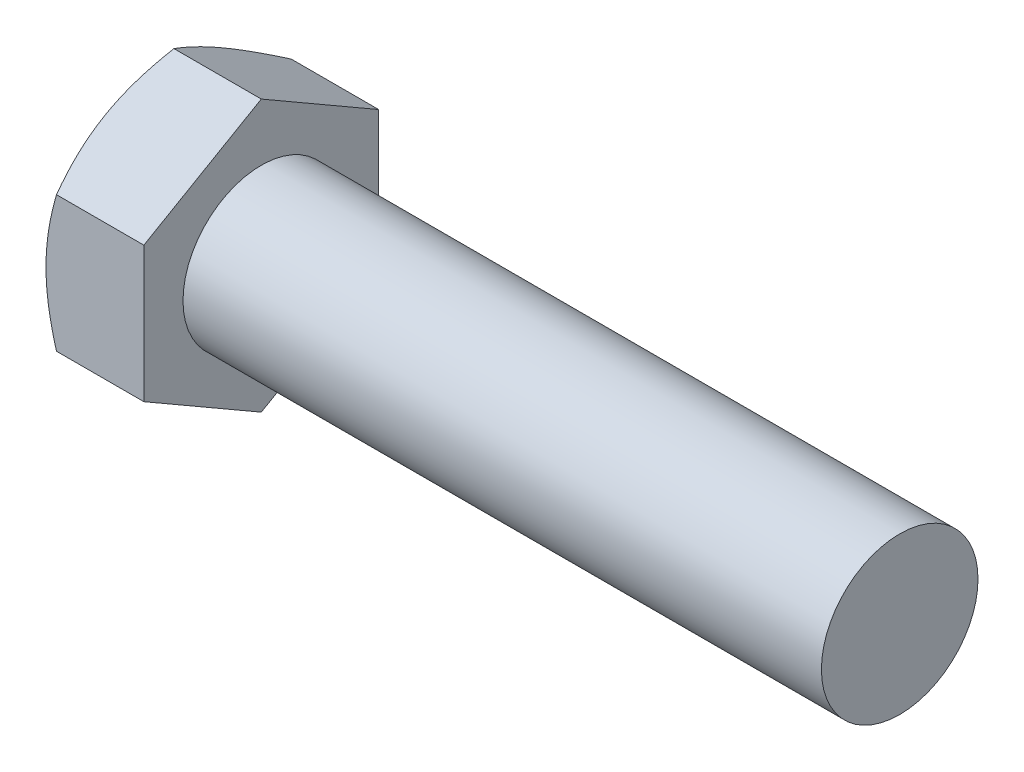
ISO-10303-21;
HEADER;
FILE_DESCRIPTION(('STEP AP214'),'2;1');
FILE_NAME('part.step','',(''),(''),'','','');
FILE_SCHEMA(('AUTOMOTIVE_DESIGN { 1 0 10303 214 1 1 1 1 }'));
ENDSEC;
DATA;
#1=APPLICATION_CONTEXT('core data for automotive mechanical design processes');
#2=APPLICATION_PROTOCOL_DEFINITION('international standard','automotive_design',2000,#1);
#3=PRODUCT_CONTEXT('',#1,'mechanical');
#4=PRODUCT('Part','Part','',(#3));
#5=PRODUCT_RELATED_PRODUCT_CATEGORY('part','',(#4));
#6=PRODUCT_DEFINITION_FORMATION('','',#4);
#7=PRODUCT_DEFINITION_CONTEXT('part definition',#1,'design');
#8=PRODUCT_DEFINITION('design','',#6,#7);
#9=PRODUCT_DEFINITION_SHAPE('','',#8);
#10=(LENGTH_UNIT() NAMED_UNIT(*) SI_UNIT(.MILLI.,.METRE.));
#11=(NAMED_UNIT(*) PLANE_ANGLE_UNIT() SI_UNIT($,.RADIAN.));
#12=(NAMED_UNIT(*) SI_UNIT($,.STERADIAN.) SOLID_ANGLE_UNIT());
#13=UNCERTAINTY_MEASURE_WITH_UNIT(LENGTH_MEASURE(1.E-05),#10,'distance_accuracy_value','');
#14=(GEOMETRIC_REPRESENTATION_CONTEXT(3) GLOBAL_UNCERTAINTY_ASSIGNED_CONTEXT((#13)) GLOBAL_UNIT_ASSIGNED_CONTEXT((#10,
#11,#12)) REPRESENTATION_CONTEXT('',''));
#15=CARTESIAN_POINT('',(0.,0.,0.));
#16=DIRECTION('',(0.,0.,1.));
#17=DIRECTION('',(1.,0.,0.));
#18=AXIS2_PLACEMENT_3D('',#15,#16,#17);
#19=CARTESIAN_POINT('',(61.,0.,0.));
#20=DIRECTION('',(-1.,0.,0.));
#21=DIRECTION('',(0.,0.,1.));
#22=AXIS2_PLACEMENT_3D('',#19,#20,#21);
#23=CYLINDRICAL_SURFACE('',#22,6.);
#24=CARTESIAN_POINT('',(0.,0.,0.));
#25=DIRECTION('',(-1.,0.,0.));
#26=DIRECTION('',(0.,0.,1.));
#27=AXIS2_PLACEMENT_3D('',#24,#25,#26);
#28=CIRCLE('',#27,6.);
#29=CARTESIAN_POINT('',(0.,0.,6.));
#30=VERTEX_POINT('',#29);
#31=EDGE_CURVE('E43',#30,#30,#28,.F.);
#32=ORIENTED_EDGE('',*,*,#31,.T.);
#33=EDGE_LOOP('',(#32));
#34=FACE_BOUND('',#33,.T.);
#35=CARTESIAN_POINT('',(48.9325515217763,0.,0.));
#36=DIRECTION('',(1.,0.,0.));
#37=DIRECTION('',(0.,0.,-1.));
#38=AXIS2_PLACEMENT_3D('',#35,#36,#37);
#39=CIRCLE('',#38,6.);
#40=CARTESIAN_POINT('',(48.9325515217763,0.,-6.));
#41=VERTEX_POINT('',#40);
#42=EDGE_CURVE('E11',#41,#41,#39,.T.);
#43=ORIENTED_EDGE('',*,*,#42,.F.);
#44=EDGE_LOOP('',(#43));
#45=FACE_BOUND('',#44,.T.);
#46=ADVANCED_FACE('F34',(#34,#45),#23,.T.);
#47=CARTESIAN_POINT('',(0.,15.5884572681199,9.));
#48=DIRECTION('',(-1.,0.,0.));
#49=DIRECTION('',(0.,0.,1.));
#50=AXIS2_PLACEMENT_3D('',#47,#48,#49);
#51=PLANE('',#50);
#52=DIRECTION('',(0.,-1.,0.));
#53=VECTOR('',#52,1.);
#54=CARTESIAN_POINT('',(0.,-5.19615242270663,9.));
#55=LINE('',#54,#53);
#56=CARTESIAN_POINT('',(0.,5.19615242270663,9.));
#57=VERTEX_POINT('',#56);
#58=CARTESIAN_POINT('',(0.,-5.19615242270663,9.));
#59=VERTEX_POINT('',#58);
#60=EDGE_CURVE('E229',#57,#59,#55,.T.);
#61=ORIENTED_EDGE('',*,*,#60,.T.);
#62=DIRECTION('',(0.,-0.5,-0.866025403784438));
#63=VECTOR('',#62,1.);
#64=CARTESIAN_POINT('',(0.,-10.3923048454133,0.));
#65=LINE('',#64,#63);
#66=CARTESIAN_POINT('',(0.,-10.3923048454133,0.));
#67=VERTEX_POINT('',#66);
#68=EDGE_CURVE('E232',#59,#67,#65,.T.);
#69=ORIENTED_EDGE('',*,*,#68,.T.);
#70=DIRECTION('',(0.,0.5,-0.866025403784439));
#71=VECTOR('',#70,1.);
#72=CARTESIAN_POINT('',(0.,-5.19615242270663,-9.));
#73=LINE('',#72,#71);
#74=CARTESIAN_POINT('',(0.,-5.19615242270663,-9.));
#75=VERTEX_POINT('',#74);
#76=EDGE_CURVE('E236',#67,#75,#73,.T.);
#77=ORIENTED_EDGE('',*,*,#76,.T.);
#78=DIRECTION('',(0.,1.,0.));
#79=VECTOR('',#78,1.);
#80=CARTESIAN_POINT('',(0.,5.19615242270663,-9.));
#81=LINE('',#80,#79);
#82=CARTESIAN_POINT('',(0.,5.19615242270663,-9.));
#83=VERTEX_POINT('',#82);
#84=EDGE_CURVE('E240',#75,#83,#81,.T.);
#85=ORIENTED_EDGE('',*,*,#84,.T.);
#86=DIRECTION('',(0.,0.5,0.866025403784439));
#87=VECTOR('',#86,1.);
#88=CARTESIAN_POINT('',(0.,10.3923048454133,0.));
#89=LINE('',#88,#87);
#90=CARTESIAN_POINT('',(0.,10.3923048454133,0.));
#91=VERTEX_POINT('',#90);
#92=EDGE_CURVE('E243',#83,#91,#89,.T.);
#93=ORIENTED_EDGE('',*,*,#92,.T.);
#94=DIRECTION('',(0.,-0.5,0.866025403784439));
#95=VECTOR('',#94,1.);
#96=CARTESIAN_POINT('',(0.,5.19615242270663,9.));
#97=LINE('',#96,#95);
#98=EDGE_CURVE('E234',#91,#57,#97,.T.);
#99=ORIENTED_EDGE('',*,*,#98,.T.);
#100=EDGE_LOOP('',(#61,#69,#77,#85,#93,#99));
#101=FACE_BOUND('',#100,.T.);
#102=ORIENTED_EDGE('',*,*,#31,.F.);
#103=EDGE_LOOP('',(#102));
#104=FACE_BOUND('',#103,.T.);
#105=ADVANCED_FACE('F169',(#101,#104),#51,.F.);
#106=CARTESIAN_POINT('',(-7.5,-5.19615242270663,9.));
#107=DIRECTION('',(0.,0.,1.));
#108=DIRECTION('',(0.,-1.,0.));
#109=AXIS2_PLACEMENT_3D('',#106,#107,#108);
#110=PLANE('',#109);
#111=DIRECTION('',(1.,0.,0.));
#112=VECTOR('',#111,1.);
#113=CARTESIAN_POINT('',(-7.5,5.19615242270663,9.));
#114=LINE('',#113,#112);
#115=CARTESIAN_POINT('',(-6.69615242270664,5.19615242270663,9.));
#116=VERTEX_POINT('',#115);
#117=EDGE_CURVE('E211',#116,#57,#114,.T.);
#118=ORIENTED_EDGE('',*,*,#117,.F.);
#119=CARTESIAN_POINT('',(-3.04439619408568,-14.0879095287474,9.));
#120=CARTESIAN_POINT('',(-3.23616569464752,-13.693655031656,9.));
#121=CARTESIAN_POINT('',(-3.42613358488755,-13.2985092852902,9.));
#122=CARTESIAN_POINT('',(-3.80145525649806,-12.5059616994229,9.));
#123=CARTESIAN_POINT('',(-3.98680833508662,-12.1085595274744,9.));
#124=CARTESIAN_POINT('',(-4.35279398301483,-11.3090404877794,9.));
#125=CARTESIAN_POINT('',(-4.53339647851532,-10.9069098067597,9.));
#126=CARTESIAN_POINT('',(-4.88738125076309,-10.0994948181489,9.));
#127=CARTESIAN_POINT('',(-5.06076386035785,-9.69421065696261,9.));
#128=CARTESIAN_POINT('',(-5.40398931297415,-8.86637898834851,9.));
#129=CARTESIAN_POINT('',(-5.57352564484564,-8.44370370637083,9.));
#130=CARTESIAN_POINT('',(-5.90008012798862,-7.59345787642534,9.));
#131=CARTESIAN_POINT('',(-6.05709689327183,-7.16588679243948,9.));
#132=CARTESIAN_POINT('',(-6.35458596789211,-6.30592235904101,9.));
#133=CARTESIAN_POINT('',(-6.4950906431671,-5.87354032550851,9.));
#134=CARTESIAN_POINT('',(-6.75513543593341,-5.0025908950088,9.));
#135=CARTESIAN_POINT('',(-6.87468201758853,-4.56402545045819,9.));
#136=CARTESIAN_POINT('',(-7.08652518452937,-3.68279147507757,9.));
#137=CARTESIAN_POINT('',(-7.17897094000698,-3.24015978607003,9.));
#138=CARTESIAN_POINT('',(-7.29336659689643,-2.5720797499083,9.));
#139=CARTESIAN_POINT('',(-7.32745445566226,-2.34868256169058,9.));
#140=CARTESIAN_POINT('',(-7.38687397352872,-1.90073399161542,9.));
#141=CARTESIAN_POINT('',(-7.41220648178002,-1.67618272383314,9.));
#142=CARTESIAN_POINT('',(-7.453285782989,-1.22921881491347,9.));
#143=CARTESIAN_POINT('',(-7.46915580731314,-1.00681754676116,9.));
#144=CARTESIAN_POINT('',(-7.49147045735779,-0.561542754950039,9.));
#145=CARTESIAN_POINT('',(-7.49791524339677,-0.338669239388495,9.));
#146=CARTESIAN_POINT('',(-7.50122518098019,0.107152397574911,9.));
#147=CARTESIAN_POINT('',(-7.49809026041465,0.330100519525731,9.));
#148=CARTESIAN_POINT('',(-7.48231893385619,0.775663087000085,9.));
#149=CARTESIAN_POINT('',(-7.4696820773313,0.998277516200149,9.));
#150=CARTESIAN_POINT('',(-7.42847699005886,1.52928538908578,9.));
#151=CARTESIAN_POINT('',(-7.39562319012104,1.83735365864231,9.));
#152=CARTESIAN_POINT('',(-7.31348089499729,2.45127496668841,9.));
#153=CARTESIAN_POINT('',(-7.26419028069688,2.75712771434452,9.));
#154=CARTESIAN_POINT('',(-7.09427111578834,3.6709642947988,9.));
#155=CARTESIAN_POINT('',(-6.95162294444611,4.27491194839587,9.));
#156=CARTESIAN_POINT('',(-6.70329904471024,5.17834875934604,9.));
#157=CARTESIAN_POINT('',(-6.613584605587,5.48249505622045,9.));
#158=CARTESIAN_POINT('',(-6.42460437874042,6.08783493597835,9.));
#159=CARTESIAN_POINT('',(-6.32533851991161,6.38902849686182,9.));
#160=CARTESIAN_POINT('',(-6.11886770324646,6.98855625464969,9.));
#161=CARTESIAN_POINT('',(-6.01166511927388,7.28689127662833,9.));
#162=CARTESIAN_POINT('',(-5.7906056948964,7.88107084488988,9.));
#163=CARTESIAN_POINT('',(-5.67674899054285,8.17691544195107,9.));
#164=CARTESIAN_POINT('',(-5.36908665724884,8.95441621347283,9.));
#165=CARTESIAN_POINT('',(-5.17061022523401,9.43422210644709,9.));
#166=CARTESIAN_POINT('',(-4.76247010128237,10.389068945959,9.));
#167=CARTESIAN_POINT('',(-4.55280529949615,10.864109414209,9.));
#168=CARTESIAN_POINT('',(-4.12486425415457,11.8104820659415,9.));
#169=CARTESIAN_POINT('',(-3.90658504150425,12.2818129025068,9.));
#170=CARTESIAN_POINT('',(-3.46341771655365,13.2213264648151,9.));
#171=CARTESIAN_POINT('',(-3.23852984291365,13.689509303494,9.));
#172=CARTESIAN_POINT('',(-2.78320833779393,14.6240308982656,9.));
#173=CARTESIAN_POINT('',(-2.55276692339174,15.0903658546186,9.));
#174=CARTESIAN_POINT('',(-2.08771687371909,16.020954118375,9.));
#175=CARTESIAN_POINT('',(-1.85310820781037,16.4852074104422,9.));
#176=CARTESIAN_POINT('',(-1.38057121082948,17.411902236615,9.));
#177=CARTESIAN_POINT('',(-1.14264355442622,17.8743441151458,9.));
#178=CARTESIAN_POINT('',(-0.66402956063397,18.7977988868519,9.));
#179=CARTESIAN_POINT('',(-0.423343212292159,19.2588117743443,9.));
#180=CARTESIAN_POINT('',(0.253008359337174,20.5465513257409,9.));
#181=CARTESIAN_POINT('',(0.691204166086711,21.3719486364897,8.99999999999999));
#182=CARTESIAN_POINT('',(1.57294903304244,23.0199314169389,8.99999999999999));
#183=CARTESIAN_POINT('',(2.01649839013289,23.8425167274221,8.99999999999999));
#184=CARTESIAN_POINT('',(2.9061980507061,25.4829119061507,8.99999999999999));
#185=CARTESIAN_POINT('',(3.35233568679584,26.3007286492642,8.99999999999999));
#186=CARTESIAN_POINT('',(4.02382689216868,27.5261617135007,8.99999999999999));
#187=CARTESIAN_POINT('',(4.24802994222312,27.9344093297817,8.99999999999999));
#188=CARTESIAN_POINT('',(4.69711875083862,28.7505282332156,8.99999999999999));
#189=CARTESIAN_POINT('',(4.92200450852238,29.1583995208514,9.));
#190=CARTESIAN_POINT('',(5.1471898299133,29.5661053950702,9.));
#191=B_SPLINE_CURVE_WITH_KNOTS('',3,(#119,#120,#121,#122,#123,#124,#125,#126,#127,#128,#129,
#130,#131,#132,#133,#134,#135,#136,#137,#138,#139,#140,#141,#142,#143,#144,#145,#146,#147,#148,
#149,#150,#151,#152,#153,#154,#155,#156,#157,#158,#159,#160,#161,#162,#163,#164,#165,#166,#167,
#168,#169,#170,#171,#172,#173,#174,#175,#176,#177,#178,#179,#180,#181,#182,#183,#184,#185,#186,
#187,#188,#189,#190),.UNSPECIFIED.,.F.,.F.,(4,2,2,2,2,2,2,2,2,2,2,2,2,2,2,2,2,2,2,2,2,2,2,2,2,2,
2,2,2,2,2,2,2,2,2,4),(0.,1.31527562659142,2.63075034407378,3.95316726196449,5.27552314681824,
6.64159484683652,8.0078175695042,9.37131599281864,10.7343931257521,12.0898202343292,
12.7676245381064,13.445363085567,14.1140707943028,14.7827671285319,15.4514684962969,
16.1202015723721,17.0491251461969,17.9781685277227,19.8371982205791,20.7884210842599,
21.7396510298601,22.6905976044299,23.6415247425726,25.1990257986525,26.7566816419492,
28.3148791271046,29.8730204096588,31.4334894012263,32.993969870351,34.5541376255593,
36.1143115772471,38.9177907178794,41.7214260479954,44.5161918828483,45.9134738129516,
47.3107539482692),.UNSPECIFIED.);
#192=CARTESIAN_POINT('',(-7.5,0.,9.));
#193=VERTEX_POINT('',#192);
#194=EDGE_CURVE('E109',#116,#193,#191,.F.);
#195=ORIENTED_EDGE('',*,*,#194,.T.);
#196=CARTESIAN_POINT('',(-6.69615242270664,-5.19615242270663,9.));
#197=VERTEX_POINT('',#196);
#198=EDGE_CURVE('E184',#193,#197,#191,.F.);
#199=ORIENTED_EDGE('',*,*,#198,.T.);
#200=DIRECTION('',(1.,0.,0.));
#201=VECTOR('',#200,1.);
#202=CARTESIAN_POINT('',(-7.5,-5.19615242270663,9.));
#203=LINE('',#202,#201);
#204=EDGE_CURVE('E212',#197,#59,#203,.T.);
#205=ORIENTED_EDGE('',*,*,#204,.T.);
#206=ORIENTED_EDGE('',*,*,#60,.F.);
#207=EDGE_LOOP('',(#118,#195,#199,#205,#206));
#208=FACE_BOUND('',#207,.T.);
#209=ADVANCED_FACE('F36',(#208),#110,.T.);
#210=CARTESIAN_POINT('',(-7.5,5.19615242270663,9.));
#211=DIRECTION('',(0.,0.866025403784439,0.5));
#212=DIRECTION('',(0.,-0.5,0.866025403784439));
#213=AXIS2_PLACEMENT_3D('',#210,#211,#212);
#214=PLANE('',#213);
#215=DIRECTION('',(1.,0.,0.));
#216=VECTOR('',#215,1.);
#217=CARTESIAN_POINT('',(-7.5,10.3923048454133,0.));
#218=LINE('',#217,#216);
#219=CARTESIAN_POINT('',(-6.69615242270664,10.3923048454133,0.));
#220=VERTEX_POINT('',#219);
#221=EDGE_CURVE('E138',#220,#91,#218,.T.);
#222=ORIENTED_EDGE('',*,*,#221,.F.);
#223=CARTESIAN_POINT('',(-6.69608575492887,10.3924203154671,-0.000199999999998416));
#224=CARTESIAN_POINT('',(-6.76201799812595,10.2782163639797,0.197607046401218));
#225=CARTESIAN_POINT('',(-6.82495859078969,10.1635669787649,0.396185606649945));
#226=CARTESIAN_POINT('',(-6.94403100234447,9.9333371508339,0.794955366044209));
#227=CARTESIAN_POINT('',(-7.00015988224794,9.81775632901307,0.99514722181845));
#228=CARTESIAN_POINT('',(-7.10484803927104,9.58544915100227,1.3975150570961));
#229=CARTESIAN_POINT('',(-7.15338922708722,9.46872074181185,1.5996945925006));
#230=CARTESIAN_POINT('',(-7.24185148321208,9.23447001335912,2.00542875589075));
#231=CARTESIAN_POINT('',(-7.28177431251673,9.11694786135373,2.20898309417891));
#232=CARTESIAN_POINT('',(-7.35131532585289,8.88408932604661,2.61230590830691));
#233=CARTESIAN_POINT('',(-7.3811624971522,8.76877014301846,2.812044592399));
#234=CARTESIAN_POINT('',(-7.43120669014092,8.53761579013204,3.21241567598899));
#235=CARTESIAN_POINT('',(-7.45140456446246,8.42178066677661,3.4130479949416));
#236=CARTESIAN_POINT('',(-7.48164565260265,8.18990950036671,3.81466063597382));
#237=CARTESIAN_POINT('',(-7.4917003904157,8.07387383570153,4.01564030266394));
#238=CARTESIAN_POINT('',(-7.50143766485492,7.84169571742973,4.41778459991642));
#239=CARTESIAN_POINT('',(-7.50112052193525,7.72555326723327,4.61894922457222));
#240=CARTESIAN_POINT('',(-7.49083604784683,7.50842142195781,4.9950326125305));
#241=CARTESIAN_POINT('',(-7.48212325996961,7.40741671639993,5.16997789436029));
#242=CARTESIAN_POINT('',(-7.45702265993463,7.20564389241818,5.51945867708335));
#243=CARTESIAN_POINT('',(-7.44063433041933,7.10487579040239,5.69399414955697));
#244=CARTESIAN_POINT('',(-7.38034344376417,6.80296159398079,6.2169248772855));
#245=CARTESIAN_POINT('',(-7.32532251765887,6.60234990505054,6.56439451510491));
#246=CARTESIAN_POINT('',(-7.18776952367485,6.1989985076226,7.263019628754));
#247=CARTESIAN_POINT('',(-7.10465438137289,5.99631027619253,7.61408594368717));
#248=CARTESIAN_POINT('',(-6.91601746056354,5.59395639760763,8.3109833040186));
#249=CARTESIAN_POINT('',(-6.81053998710664,5.39428559809853,8.65682327355628));
#250=CARTESIAN_POINT('',(-6.69608575492887,5.19603695265279,9.0002));
#251=B_SPLINE_CURVE_WITH_KNOTS('',3,(#223,#224,#225,#226,#227,#228,#229,#230,#231,#232,#233,
#234,#235,#236,#237,#238,#239,#240,#241,#242,#243,#244,#245,#246,#247,#248,#249,#250),
.UNSPECIFIED.,.F.,.F.,(4,2,2,2,2,2,2,2,2,2,2,2,2,4),(0.,0.713219249102577,1.42674513853509,
2.14194697262263,2.8570025303448,3.55449749123034,4.25193080859215,4.94857085059645,
5.64518936892662,6.25162976378283,6.8581110406634,8.07193747617893,9.31268391793541,
10.5509947443908),.UNSPECIFIED.);
#252=CARTESIAN_POINT('',(-7.5,7.79422863405994,4.5));
#253=VERTEX_POINT('',#252);
#254=EDGE_CURVE('E113',#220,#253,#251,.T.);
#255=ORIENTED_EDGE('',*,*,#254,.T.);
#256=EDGE_CURVE('E105',#253,#116,#251,.T.);
#257=ORIENTED_EDGE('',*,*,#256,.T.);
#258=ORIENTED_EDGE('',*,*,#117,.T.);
#259=ORIENTED_EDGE('',*,*,#98,.F.);
#260=EDGE_LOOP('',(#222,#255,#257,#258,#259));
#261=FACE_BOUND('',#260,.T.);
#262=ADVANCED_FACE('F136',(#261),#214,.T.);
#263=CARTESIAN_POINT('',(-7.5,10.3923048454133,0.));
#264=DIRECTION('',(0.,0.866025403784439,-0.5));
#265=DIRECTION('',(0.,0.5,0.866025403784439));
#266=AXIS2_PLACEMENT_3D('',#263,#264,#265);
#267=PLANE('',#266);
#268=DIRECTION('',(1.,0.,0.));
#269=VECTOR('',#268,1.);
#270=CARTESIAN_POINT('',(-7.5,5.19615242270663,-9.));
#271=LINE('',#270,#269);
#272=CARTESIAN_POINT('',(-6.69615242270664,5.19615242270663,-9.));
#273=VERTEX_POINT('',#272);
#274=EDGE_CURVE('E248',#273,#83,#271,.T.);
#275=ORIENTED_EDGE('',*,*,#274,.F.);
#276=CARTESIAN_POINT('',(-6.69608575492887,5.19603695265279,-9.0002));
#277=CARTESIAN_POINT('',(-6.76201799812595,5.31024090414014,-8.80239295359878));
#278=CARTESIAN_POINT('',(-6.82495859078969,5.42489028935503,-8.60381439335005));
#279=CARTESIAN_POINT('',(-6.94403100234446,5.65512011728599,-8.20504463395579));
#280=CARTESIAN_POINT('',(-7.00015988224794,5.77070093910682,-8.00485277818155));
#281=CARTESIAN_POINT('',(-7.10484803927104,6.00300811711762,-7.6024849429039));
#282=CARTESIAN_POINT('',(-7.15338922708722,6.11973652630804,-7.4003054074994));
#283=CARTESIAN_POINT('',(-7.24185148321208,6.35398725476077,-6.99457124410925));
#284=CARTESIAN_POINT('',(-7.28177431251673,6.47150940676616,-6.79101690582109));
#285=CARTESIAN_POINT('',(-7.35131532585289,6.70436794207328,-6.38769409169308));
#286=CARTESIAN_POINT('',(-7.3811624971522,6.81968712510143,-6.18795540760099));
#287=CARTESIAN_POINT('',(-7.43120669014092,7.05084147798785,-5.787584324011));
#288=CARTESIAN_POINT('',(-7.45140456446246,7.16667660134328,-5.58695200505839));
#289=CARTESIAN_POINT('',(-7.48164565260266,7.39854776775318,-5.18533936402618));
#290=CARTESIAN_POINT('',(-7.4917003904157,7.51458343241836,-4.98435969733606));
#291=CARTESIAN_POINT('',(-7.50143766485492,7.74676155069016,-4.58221540008357));
#292=CARTESIAN_POINT('',(-7.50112052193525,7.86290400088662,-4.38105077542777));
#293=CARTESIAN_POINT('',(-7.49083604784683,8.08003584616208,-4.00496738746949));
#294=CARTESIAN_POINT('',(-7.48212325996961,8.18104055171996,-3.8300221056397));
#295=CARTESIAN_POINT('',(-7.45702265993463,8.38281337570172,-3.48054132291665));
#296=CARTESIAN_POINT('',(-7.44063433041933,8.4835814777175,-3.30600585044302));
#297=CARTESIAN_POINT('',(-7.38034344376417,8.7854956741391,-2.78307512271449));
#298=CARTESIAN_POINT('',(-7.32532251765887,8.98610736306936,-2.43560548489508));
#299=CARTESIAN_POINT('',(-7.18776952367485,9.38945876049729,-1.73698037124599));
#300=CARTESIAN_POINT('',(-7.10465438137289,9.59214699192736,-1.38591405631282));
#301=CARTESIAN_POINT('',(-6.91601746056354,9.99450087051226,-0.689016695981392));
#302=CARTESIAN_POINT('',(-6.81053998710664,10.1941716700214,-0.343176726443719));
#303=CARTESIAN_POINT('',(-6.69608575492887,10.3924203154671,0.000200000000002001));
#304=B_SPLINE_CURVE_WITH_KNOTS('',3,(#276,#277,#278,#279,#280,#281,#282,#283,#284,#285,#286,
#287,#288,#289,#290,#291,#292,#293,#294,#295,#296,#297,#298,#299,#300,#301,#302,#303),
.UNSPECIFIED.,.F.,.F.,(4,2,2,2,2,2,2,2,2,2,2,2,2,4),(0.,0.713219249102579,1.42674513853509,
2.14194697262263,2.85700253034481,3.55449749123034,4.25193080859215,4.94857085059646,
5.64518936892663,6.25162976378284,6.85811104066341,8.07193747617895,9.31268391793542,
10.5509947443908),.UNSPECIFIED.);
#305=CARTESIAN_POINT('',(-7.5,7.79422863405995,-4.5));
#306=VERTEX_POINT('',#305);
#307=EDGE_CURVE('E235',#273,#306,#304,.T.);
#308=ORIENTED_EDGE('',*,*,#307,.T.);
#309=EDGE_CURVE('E121',#306,#220,#304,.T.);
#310=ORIENTED_EDGE('',*,*,#309,.T.);
#311=ORIENTED_EDGE('',*,*,#221,.T.);
#312=ORIENTED_EDGE('',*,*,#92,.F.);
#313=EDGE_LOOP('',(#275,#308,#310,#311,#312));
#314=FACE_BOUND('',#313,.T.);
#315=ADVANCED_FACE('F265',(#314),#267,.T.);
#316=CARTESIAN_POINT('',(-7.5,5.19615242270663,-9.));
#317=DIRECTION('',(0.,0.,-1.));
#318=DIRECTION('',(-1.,0.,0.));
#319=AXIS2_PLACEMENT_3D('',#316,#317,#318);
#320=PLANE('',#319);
#321=DIRECTION('',(1.,0.,0.));
#322=VECTOR('',#321,1.);
#323=CARTESIAN_POINT('',(-7.5,-5.19615242270663,-9.));
#324=LINE('',#323,#322);
#325=CARTESIAN_POINT('',(-6.69615242270664,-5.19615242270663,-9.));
#326=VERTEX_POINT('',#325);
#327=EDGE_CURVE('E203',#326,#75,#324,.T.);
#328=ORIENTED_EDGE('',*,*,#327,.F.);
#329=CARTESIAN_POINT('',(-3.04439619559267,-14.08790952565,-9.));
#330=CARTESIAN_POINT('',(-3.2361656960916,-13.6936550286629,-9.));
#331=CARTESIAN_POINT('',(-3.42613358626875,-13.2985092824014,-9.));
#332=CARTESIAN_POINT('',(-3.80145525775381,-12.505961696743,-9.));
#333=CARTESIAN_POINT('',(-3.98680833627981,-12.1085595248991,-9.));
#334=CARTESIAN_POINT('',(-4.35279398408283,-11.309040485415,-9.));
#335=CARTESIAN_POINT('',(-4.53339647952071,-10.9069098045015,-9.));
#336=CARTESIAN_POINT('',(-4.88738125164431,-10.0994948161039,-9.));
#337=CARTESIAN_POINT('',(-5.06076386117751,-9.69421065502451,-9.));
#338=CARTESIAN_POINT('',(-5.40398931366896,-8.86637898663251,-9.));
#339=CARTESIAN_POINT('',(-5.57352564547731,-8.44370370477005,-9.));
#340=CARTESIAN_POINT('',(-5.90008012849736,-7.59345787505685,-9.));
#341=CARTESIAN_POINT('',(-6.05709689372078,-7.16588679118806,-9.));
#342=CARTESIAN_POINT('',(-6.35458596822724,-6.30592235802592,-9.));
#343=CARTESIAN_POINT('',(-6.49509064344816,-5.87354032461267,-9.));
#344=CARTESIAN_POINT('',(-6.75513543611514,-5.00259089435468,-9.));
#345=CARTESIAN_POINT('',(-6.87468201772501,-4.56402544992655,-9.));
#346=CARTESIAN_POINT('',(-7.08652518457455,-3.68279147485387,-9.));
#347=CARTESIAN_POINT('',(-7.17897094000962,-3.24015978603267,-9.));
#348=CARTESIAN_POINT('',(-7.29336659685629,-2.57207975015372,-9.));
#349=CARTESIAN_POINT('',(-7.32745445561136,-2.34868256203079,-9.));
#350=CARTESIAN_POINT('',(-7.38687397346411,-1.90073399214598,-9.));
#351=CARTESIAN_POINT('',(-7.41220648171245,-1.67618272445927,-9.));
#352=CARTESIAN_POINT('',(-7.45328578292396,-1.22921881572878,-9.));
#353=CARTESIAN_POINT('',(-7.46915580725343,-1.00681754767006,-9.));
#354=CARTESIAN_POINT('',(-7.49147045731702,-0.561542756045948,-9.));
#355=CARTESIAN_POINT('',(-7.4979152433696,-0.338669240577815,-9.));
#356=CARTESIAN_POINT('',(-7.50122518098831,0.107152396199469,-9.));
#357=CARTESIAN_POINT('',(-7.49809026044445,0.330100518057577,-9.));
#358=CARTESIAN_POINT('',(-7.48231893393686,0.775663085347714,-9.));
#359=CARTESIAN_POINT('',(-7.46968207744116,0.998277514456274,-9.));
#360=CARTESIAN_POINT('',(-7.42847699024048,1.52928538720055,-9.));
#361=CARTESIAN_POINT('',(-7.39562319034397,1.83735365670763,-9.));
#362=CARTESIAN_POINT('',(-7.31348089530505,2.45127496465707,-9.));
#363=CARTESIAN_POINT('',(-7.26419028104817,2.75712771226597,-9.));
#364=CARTESIAN_POINT('',(-7.09427111627111,3.67096429258118,-9.));
#365=CARTESIAN_POINT('',(-6.95162294501769,4.27491194608916,-9.));
#366=CARTESIAN_POINT('',(-6.70329904541289,5.17834875690608,-9.));
#367=CARTESIAN_POINT('',(-6.61358460633364,5.48249505373512,-9.));
#368=CARTESIAN_POINT('',(-6.42460437957371,6.08783493340279,-9.));
#369=CARTESIAN_POINT('',(-6.32533852078755,6.38902849424141,-9.));
#370=CARTESIAN_POINT('',(-6.11886770420619,6.98855625193989,-9.));
#371=CARTESIAN_POINT('',(-6.01166512027474,7.28689127387399,-9.));
#372=CARTESIAN_POINT('',(-5.79060569597811,7.88107084204647,-9.));
#373=CARTESIAN_POINT('',(-5.67674899166425,8.17691543906312,-9.));
#374=CARTESIAN_POINT('',(-5.36908665843717,8.95441621055849,-9.));
#375=CARTESIAN_POINT('',(-5.17061022644563,9.43422210354969,-9.));
#376=CARTESIAN_POINT('',(-4.76247010253406,10.3890689430934,-9.));
#377=CARTESIAN_POINT('',(-4.55280530076459,10.8641094113581,-9.));
#378=CARTESIAN_POINT('',(-4.12486425545173,11.8104820631186,-9.));
#379=CARTESIAN_POINT('',(-3.90658504281337,12.2818128996972,-9.));
#380=CARTESIAN_POINT('',(-3.46341771788329,13.2213264620305,-9.));
#381=CARTESIAN_POINT('',(-3.23852984425184,13.6895093007212,-9.));
#382=CARTESIAN_POINT('',(-2.78320833914638,14.624030895516,-9.));
#383=CARTESIAN_POINT('',(-2.55276692474988,15.0903658518804,-9.));
#384=CARTESIAN_POINT('',(-2.08771687508671,16.0209541156588,-9.));
#385=CARTESIAN_POINT('',(-1.85310820918176,16.4852074077365,-9.));
#386=CARTESIAN_POINT('',(-1.38057121220706,17.4119022339297,-9.));
#387=CARTESIAN_POINT('',(-1.14264355580619,17.8743441124702,-9.));
#388=CARTESIAN_POINT('',(-0.664029562017613,18.7977988841952,-9.));
#389=CARTESIAN_POINT('',(-0.423343213677082,19.2588117716969,-9.));
#390=CARTESIAN_POINT('',(0.253008357941855,20.5465513231034,-9.));
#391=CARTESIAN_POINT('',(0.6912041646831,21.3719486338525,-9.));
#392=CARTESIAN_POINT('',(1.57294903162394,23.0199314143015,-9.));
#393=CARTESIAN_POINT('',(2.01649838870778,23.8425167247842,-9.));
#394=CARTESIAN_POINT('',(2.90619804926756,25.4829119035086,-9.));
#395=CARTESIAN_POINT('',(3.35233568535047,26.3007286466185,-9.));
#396=CARTESIAN_POINT('',(4.02382689071362,27.5261617108493,-9.));
#397=CARTESIAN_POINT('',(4.24802994076492,27.9344093271282,-9.));
#398=CARTESIAN_POINT('',(4.69711874937431,28.7505282305581,-9.));
#399=CARTESIAN_POINT('',(4.9220045070551,29.1583995181917,-9.));
#400=CARTESIAN_POINT('',(5.14718982844312,29.5661053924085,-9.));
#401=B_SPLINE_CURVE_WITH_KNOTS('',3,(#329,#330,#331,#332,#333,#334,#335,#336,#337,#338,#339,
#340,#341,#342,#343,#344,#345,#346,#347,#348,#349,#350,#351,#352,#353,#354,#355,#356,#357,#358,
#359,#360,#361,#362,#363,#364,#365,#366,#367,#368,#369,#370,#371,#372,#373,#374,#375,#376,#377,
#378,#379,#380,#381,#382,#383,#384,#385,#386,#387,#388,#389,#390,#391,#392,#393,#394,#395,#396,
#397,#398,#399,#400),.UNSPECIFIED.,.F.,.F.,(4,2,2,2,2,2,2,2,2,2,2,2,2,2,2,2,2,2,2,2,2,2,2,2,2,2,
2,2,2,2,2,2,2,2,2,4),(0.,1.31527562622769,2.63075034334626,3.95316726086932,5.27552314535543,
6.64159484498241,8.00781756725865,9.37131599018295,10.7343931227265,12.0898202307318,
12.7676245342232,13.4453630813982,14.1140707898553,14.7827671238057,15.4514684912919,
16.1202015670884,17.0491251407526,17.9781685221178,19.8371982146524,20.7884210781653,
21.7396510235976,22.6905975979999,23.6415247359751,25.1990257920749,26.7566816353918,
28.3148791205681,29.8730204031431,31.4334893947337,32.9939698638814,34.5541376191124,
36.114311570823,38.9177907114444,41.7214260415497,44.5161918763832,45.9134738064767,
47.3107539417844),.UNSPECIFIED.);
#402=CARTESIAN_POINT('',(-7.5,0.,-9.));
#403=VERTEX_POINT('',#402);
#404=EDGE_CURVE('E114',#326,#403,#401,.T.);
#405=ORIENTED_EDGE('',*,*,#404,.T.);
#406=EDGE_CURVE('E139',#403,#273,#401,.T.);
#407=ORIENTED_EDGE('',*,*,#406,.T.);
#408=ORIENTED_EDGE('',*,*,#274,.T.);
#409=ORIENTED_EDGE('',*,*,#84,.F.);
#410=EDGE_LOOP('',(#328,#405,#407,#408,#409));
#411=FACE_BOUND('',#410,.T.);
#412=ADVANCED_FACE('F200',(#411),#320,.T.);
#413=CARTESIAN_POINT('',(-7.5,-5.19615242270663,-9.));
#414=DIRECTION('',(0.,-0.866025403784439,-0.5));
#415=DIRECTION('',(0.,0.5,-0.866025403784439));
#416=AXIS2_PLACEMENT_3D('',#413,#414,#415);
#417=PLANE('',#416);
#418=DIRECTION('',(1.,0.,0.));
#419=VECTOR('',#418,1.);
#420=CARTESIAN_POINT('',(-7.5,-10.3923048454133,0.));
#421=LINE('',#420,#419);
#422=CARTESIAN_POINT('',(-6.69615242270664,-10.3923048454133,0.));
#423=VERTEX_POINT('',#422);
#424=EDGE_CURVE('E250',#423,#67,#421,.T.);
#425=ORIENTED_EDGE('',*,*,#424,.F.);
#426=CARTESIAN_POINT('',(-6.69608575492887,-10.3924203154671,0.000200000000000097));
#427=CARTESIAN_POINT('',(-6.76201799812595,-10.2782163639797,-0.197607046401216));
#428=CARTESIAN_POINT('',(-6.82495859078969,-10.1635669787649,-0.396185606649944));
#429=CARTESIAN_POINT('',(-6.94403100234447,-9.9333371508339,-0.79495536604421));
#430=CARTESIAN_POINT('',(-7.00015988224794,-9.81775632901307,-0.995147221818451));
#431=CARTESIAN_POINT('',(-7.10484803927104,-9.58544915100227,-1.3975150570961));
#432=CARTESIAN_POINT('',(-7.15338922708722,-9.46872074181185,-1.5996945925006));
#433=CARTESIAN_POINT('',(-7.24185148321208,-9.23447001335912,-2.00542875589075));
#434=CARTESIAN_POINT('',(-7.28177431251673,-9.11694786135373,-2.20898309417891));
#435=CARTESIAN_POINT('',(-7.35131532585289,-8.88408932604661,-2.61230590830692));
#436=CARTESIAN_POINT('',(-7.3811624971522,-8.76877014301846,-2.81204459239901));
#437=CARTESIAN_POINT('',(-7.43120669014092,-8.53761579013204,-3.212415675989));
#438=CARTESIAN_POINT('',(-7.45140456446246,-8.42178066677661,-3.41304799494161));
#439=CARTESIAN_POINT('',(-7.48164565260266,-8.1899095003667,-3.81466063597382));
#440=CARTESIAN_POINT('',(-7.4917003904157,-8.07387383570152,-4.01564030266394));
#441=CARTESIAN_POINT('',(-7.50143766485492,-7.84169571742973,-4.41778459991643));
#442=CARTESIAN_POINT('',(-7.50112052193525,-7.72555326723327,-4.61894922457223));
#443=CARTESIAN_POINT('',(-7.49083604784683,-7.50842142195781,-4.99503261253051));
#444=CARTESIAN_POINT('',(-7.4821232599696,-7.40741671639993,-5.16997789436029));
#445=CARTESIAN_POINT('',(-7.45702265993463,-7.20564389241817,-5.51945867708335));
#446=CARTESIAN_POINT('',(-7.44063433041933,-7.10487579040239,-5.69399414955697));
#447=CARTESIAN_POINT('',(-7.38034344376417,-6.80296159398079,-6.21692487728551));
#448=CARTESIAN_POINT('',(-7.32532251765887,-6.60234990505054,-6.56439451510491));
#449=CARTESIAN_POINT('',(-7.18776952367485,-6.1989985076226,-7.263019628754));
#450=CARTESIAN_POINT('',(-7.10465438137289,-5.99631027619253,-7.61408594368717));
#451=CARTESIAN_POINT('',(-6.91601746056354,-5.59395639760764,-8.3109833040186));
#452=CARTESIAN_POINT('',(-6.81053998710664,-5.39428559809853,-8.65682327355628));
#453=CARTESIAN_POINT('',(-6.69608575492887,-5.1960369526528,-9.0002));
#454=B_SPLINE_CURVE_WITH_KNOTS('',3,(#426,#427,#428,#429,#430,#431,#432,#433,#434,#435,#436,
#437,#438,#439,#440,#441,#442,#443,#444,#445,#446,#447,#448,#449,#450,#451,#452,#453),
.UNSPECIFIED.,.F.,.F.,(4,2,2,2,2,2,2,2,2,2,2,2,2,4),(0.,0.713219249102578,1.42674513853509,
2.14194697262263,2.85700253034481,3.55449749123034,4.25193080859215,4.94857085059646,
5.64518936892663,6.25162976378284,6.85811104066341,8.07193747617894,9.31268391793542,
10.5509947443908),.UNSPECIFIED.);
#455=CARTESIAN_POINT('',(-7.5,-7.79422863405995,-4.5));
#456=VERTEX_POINT('',#455);
#457=EDGE_CURVE('E58',#423,#456,#454,.T.);
#458=ORIENTED_EDGE('',*,*,#457,.T.);
#459=EDGE_CURVE('E191',#456,#326,#454,.T.);
#460=ORIENTED_EDGE('',*,*,#459,.T.);
#461=ORIENTED_EDGE('',*,*,#327,.T.);
#462=ORIENTED_EDGE('',*,*,#76,.F.);
#463=EDGE_LOOP('',(#425,#458,#460,#461,#462));
#464=FACE_BOUND('',#463,.T.);
#465=ADVANCED_FACE('F255',(#464),#417,.T.);
#466=CARTESIAN_POINT('',(-7.5,-10.3923048454133,0.));
#467=DIRECTION('',(0.,-0.866025403784439,0.5));
#468=DIRECTION('',(0.,-0.5,-0.866025403784439));
#469=AXIS2_PLACEMENT_3D('',#466,#467,#468);
#470=PLANE('',#469);
#471=ORIENTED_EDGE('',*,*,#204,.F.);
#472=CARTESIAN_POINT('',(-6.69608575492887,-5.19603695265279,9.0002));
#473=CARTESIAN_POINT('',(-6.76201799812595,-5.31024090414014,8.80239295359879));
#474=CARTESIAN_POINT('',(-6.82495859078969,-5.42489028935503,8.60381439335005));
#475=CARTESIAN_POINT('',(-6.94403100234446,-5.65512011728599,8.20504463395579));
#476=CARTESIAN_POINT('',(-7.00015988224794,-5.77070093910682,8.00485277818155));
#477=CARTESIAN_POINT('',(-7.10484803927104,-6.00300811711762,7.6024849429039));
#478=CARTESIAN_POINT('',(-7.15338922708722,-6.11973652630804,7.4003054074994));
#479=CARTESIAN_POINT('',(-7.24185148321208,-6.35398725476077,6.99457124410926));
#480=CARTESIAN_POINT('',(-7.28177431251673,-6.47150940676616,6.79101690582109));
#481=CARTESIAN_POINT('',(-7.35131532585289,-6.70436794207328,6.38769409169309));
#482=CARTESIAN_POINT('',(-7.3811624971522,-6.81968712510143,6.187955407601));
#483=CARTESIAN_POINT('',(-7.43120669014092,-7.05084147798785,5.787584324011));
#484=CARTESIAN_POINT('',(-7.45140456446246,-7.16667660134328,5.58695200505839));
#485=CARTESIAN_POINT('',(-7.48164565260265,-7.39854776775318,5.18533936402618));
#486=CARTESIAN_POINT('',(-7.4917003904157,-7.51458343241837,4.98435969733607));
#487=CARTESIAN_POINT('',(-7.50143766485492,-7.74676155069016,4.58221540008358));
#488=CARTESIAN_POINT('',(-7.50112052193525,-7.86290400088661,4.38105077542777));
#489=CARTESIAN_POINT('',(-7.49083604784683,-8.08003584616207,4.00496738746949));
#490=CARTESIAN_POINT('',(-7.48212325996961,-8.18104055171996,3.83002210563971));
#491=CARTESIAN_POINT('',(-7.45702265993463,-8.38281337570172,3.48054132291665));
#492=CARTESIAN_POINT('',(-7.44063433041933,-8.4835814777175,3.30600585044303));
#493=CARTESIAN_POINT('',(-7.38034344376417,-8.7854956741391,2.78307512271449));
#494=CARTESIAN_POINT('',(-7.32532251765887,-8.98610736306936,2.43560548489508));
#495=CARTESIAN_POINT('',(-7.18776952367485,-9.38945876049729,1.736980371246));
#496=CARTESIAN_POINT('',(-7.10465438137289,-9.59214699192736,1.38591405631283));
#497=CARTESIAN_POINT('',(-6.91601746056354,-9.99450087051226,0.689016695981393));
#498=CARTESIAN_POINT('',(-6.81053998710664,-10.1941716700214,0.34317672644372));
#499=CARTESIAN_POINT('',(-6.69608575492887,-10.3924203154671,-0.000200000000000254));
#500=B_SPLINE_CURVE_WITH_KNOTS('',3,(#472,#473,#474,#475,#476,#477,#478,#479,#480,#481,#482,
#483,#484,#485,#486,#487,#488,#489,#490,#491,#492,#493,#494,#495,#496,#497,#498,#499),
.UNSPECIFIED.,.F.,.F.,(4,2,2,2,2,2,2,2,2,2,2,2,2,4),(0.,0.713219249102577,1.42674513853509,
2.14194697262263,2.85700253034481,3.55449749123034,4.25193080859215,4.94857085059645,
5.64518936892663,6.25162976378284,6.85811104066341,8.07193747617894,9.31268391793542,
10.5509947443908),.UNSPECIFIED.);
#501=CARTESIAN_POINT('',(-7.5,-7.79422863405994,4.5));
#502=VERTEX_POINT('',#501);
#503=EDGE_CURVE('E192',#197,#502,#500,.T.);
#504=ORIENTED_EDGE('',*,*,#503,.T.);
#505=EDGE_CURVE('E133',#502,#423,#500,.T.);
#506=ORIENTED_EDGE('',*,*,#505,.T.);
#507=ORIENTED_EDGE('',*,*,#424,.T.);
#508=ORIENTED_EDGE('',*,*,#68,.F.);
#509=EDGE_LOOP('',(#471,#504,#506,#507,#508));
#510=FACE_BOUND('',#509,.T.);
#511=ADVANCED_FACE('F253',(#510),#470,.T.);
#512=CARTESIAN_POINT('',(-7.5,0.,0.));
#513=DIRECTION('',(1.,0.,0.));
#514=DIRECTION('',(0.,0.,1.));
#515=AXIS2_PLACEMENT_3D('',#512,#513,#514);
#516=CONICAL_SURFACE('',#515,9.,1.0471975511966);
#517=CARTESIAN_POINT('',(-7.5,0.,0.));
#518=DIRECTION('',(-1.,0.,0.));
#519=DIRECTION('',(0.,0.,1.));
#520=AXIS2_PLACEMENT_3D('',#517,#518,#519);
#521=CIRCLE('',#520,9.);
#522=EDGE_CURVE('E128',#502,#193,#521,.T.);
#523=ORIENTED_EDGE('',*,*,#522,.F.);
#524=ORIENTED_EDGE('',*,*,#503,.F.);
#525=ORIENTED_EDGE('',*,*,#198,.F.);
#526=EDGE_LOOP('',(#523,#524,#525));
#527=FACE_BOUND('',#526,.T.);
#528=ADVANCED_FACE('F166',(#527),#516,.T.);
#529=ORIENTED_EDGE('',*,*,#505,.F.);
#530=EDGE_CURVE('E208',#456,#502,#521,.T.);
#531=ORIENTED_EDGE('',*,*,#530,.F.);
#532=ORIENTED_EDGE('',*,*,#457,.F.);
#533=EDGE_LOOP('',(#529,#531,#532));
#534=FACE_BOUND('',#533,.T.);
#535=ADVANCED_FACE('F160',(#534),#516,.T.);
#536=ORIENTED_EDGE('',*,*,#459,.F.);
#537=EDGE_CURVE('E207',#403,#456,#521,.T.);
#538=ORIENTED_EDGE('',*,*,#537,.F.);
#539=ORIENTED_EDGE('',*,*,#404,.F.);
#540=EDGE_LOOP('',(#536,#538,#539));
#541=FACE_BOUND('',#540,.T.);
#542=ADVANCED_FACE('F165',(#541),#516,.T.);
#543=ORIENTED_EDGE('',*,*,#406,.F.);
#544=EDGE_CURVE('E126',#306,#403,#521,.T.);
#545=ORIENTED_EDGE('',*,*,#544,.F.);
#546=ORIENTED_EDGE('',*,*,#307,.F.);
#547=EDGE_LOOP('',(#543,#545,#546));
#548=FACE_BOUND('',#547,.T.);
#549=ADVANCED_FACE('F167',(#548),#516,.T.);
#550=EDGE_CURVE('E118',#253,#306,#521,.T.);
#551=ORIENTED_EDGE('',*,*,#550,.F.);
#552=ORIENTED_EDGE('',*,*,#254,.F.);
#553=ORIENTED_EDGE('',*,*,#309,.F.);
#554=EDGE_LOOP('',(#551,#552,#553));
#555=FACE_BOUND('',#554,.T.);
#556=ADVANCED_FACE('F119',(#555),#516,.T.);
#557=CARTESIAN_POINT('',(-7.5,0.,0.));
#558=DIRECTION('',(-1.,0.,0.));
#559=DIRECTION('',(0.,0.,1.));
#560=AXIS2_PLACEMENT_3D('',#557,#558,#559);
#561=CIRCLE('',#560,9.);
#562=EDGE_CURVE('E50',#193,#253,#561,.T.);
#563=ORIENTED_EDGE('',*,*,#562,.F.);
#564=ORIENTED_EDGE('',*,*,#194,.F.);
#565=ORIENTED_EDGE('',*,*,#256,.F.);
#566=EDGE_LOOP('',(#563,#564,#565));
#567=FACE_BOUND('',#566,.T.);
#568=ADVANCED_FACE('F107',(#567),#516,.T.);
#569=CARTESIAN_POINT('',(-7.5,15.5884572681199,9.));
#570=DIRECTION('',(-1.,0.,0.));
#571=DIRECTION('',(0.,0.,1.));
#572=AXIS2_PLACEMENT_3D('',#569,#570,#571);
#573=PLANE('',#572);
#574=ORIENTED_EDGE('',*,*,#522,.T.);
#575=ORIENTED_EDGE('',*,*,#562,.T.);
#576=ORIENTED_EDGE('',*,*,#550,.T.);
#577=ORIENTED_EDGE('',*,*,#544,.T.);
#578=ORIENTED_EDGE('',*,*,#537,.T.);
#579=ORIENTED_EDGE('',*,*,#530,.T.);
#580=EDGE_LOOP('',(#574,#575,#576,#577,#578,#579));
#581=FACE_BOUND('',#580,.T.);
#582=ADVANCED_FACE('F130',(#581),#573,.T.);
#583=CARTESIAN_POINT('',(48.9325515217763,99.6937628838041,-10.439505749898));
#584=DIRECTION('',(1.,0.,0.));
#585=DIRECTION('',(0.,0.,-1.));
#586=AXIS2_PLACEMENT_3D('',#583,#584,#585);
#587=PLANE('',#586);
#588=ORIENTED_EDGE('',*,*,#42,.T.);
#589=EDGE_LOOP('',(#588));
#590=FACE_BOUND('',#589,.T.);
#591=ADVANCED_FACE('F284',(#590),#587,.T.);
#592=CLOSED_SHELL('',(#46,#105,#209,#262,#315,#412,#465,#511,#528,#535,#542,#549,#556,#568,#582,#591));
#593=MANIFOLD_SOLID_BREP('B2',#592);
#594=ADVANCED_BREP_SHAPE_REPRESENTATION('',(#18,#593),#14);
#595=SHAPE_DEFINITION_REPRESENTATION(#9,#594);
ENDSEC;
END-ISO-10303-21;
